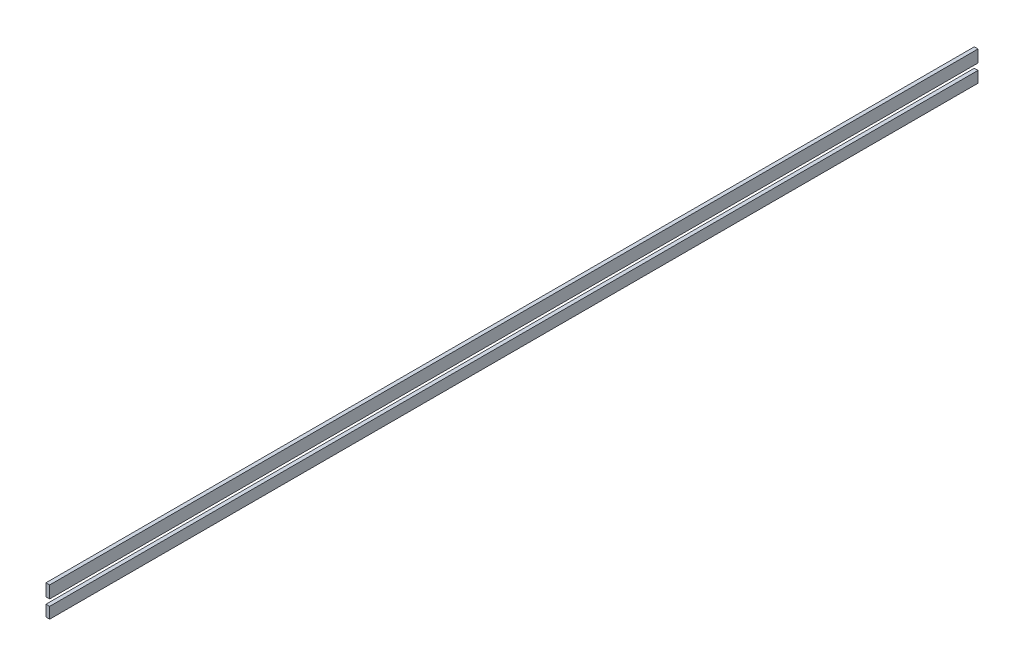
ISO-10303-21;
HEADER;
FILE_DESCRIPTION(('STEP AP214'),'2;1');
FILE_NAME('part.step','',(''),(''),'','','');
FILE_SCHEMA(('AUTOMOTIVE_DESIGN { 1 0 10303 214 1 1 1 1 }'));
ENDSEC;
DATA;
#1=APPLICATION_CONTEXT('core data for automotive mechanical design processes');
#2=APPLICATION_PROTOCOL_DEFINITION('international standard','automotive_design',2000,#1);
#3=PRODUCT_CONTEXT('',#1,'mechanical');
#4=PRODUCT('Part','Part','',(#3));
#5=PRODUCT_RELATED_PRODUCT_CATEGORY('part','',(#4));
#6=PRODUCT_DEFINITION_FORMATION('','',#4);
#7=PRODUCT_DEFINITION_CONTEXT('part definition',#1,'design');
#8=PRODUCT_DEFINITION('design','',#6,#7);
#9=PRODUCT_DEFINITION_SHAPE('','',#8);
#10=(LENGTH_UNIT() NAMED_UNIT(*) SI_UNIT(.MILLI.,.METRE.));
#11=(NAMED_UNIT(*) PLANE_ANGLE_UNIT() SI_UNIT($,.RADIAN.));
#12=(NAMED_UNIT(*) SI_UNIT($,.STERADIAN.) SOLID_ANGLE_UNIT());
#13=UNCERTAINTY_MEASURE_WITH_UNIT(LENGTH_MEASURE(1.E-05),#10,'distance_accuracy_value','');
#14=(GEOMETRIC_REPRESENTATION_CONTEXT(3) GLOBAL_UNCERTAINTY_ASSIGNED_CONTEXT((#13)) GLOBAL_UNIT_ASSIGNED_CONTEXT((#10,
#11,#12)) REPRESENTATION_CONTEXT('',''));
#15=CARTESIAN_POINT('',(0.,0.,0.));
#16=DIRECTION('',(0.,0.,1.));
#17=DIRECTION('',(1.,0.,0.));
#18=AXIS2_PLACEMENT_3D('',#15,#16,#17);
#19=CARTESIAN_POINT('',(1.,-2.,-250.));
#20=DIRECTION('',(1.,0.,0.));
#21=DIRECTION('',(0.,1.,0.));
#22=AXIS2_PLACEMENT_3D('',#19,#20,#21);
#23=PLANE('',#22);
#24=DIRECTION('',(0.,0.,1.));
#25=VECTOR('',#24,1.);
#26=CARTESIAN_POINT('',(1.,-2.,-250.));
#27=LINE('',#26,#25);
#28=CARTESIAN_POINT('',(1.,-2.,-250.));
#29=VERTEX_POINT('',#28);
#30=CARTESIAN_POINT('',(1.,-2.,250.));
#31=VERTEX_POINT('',#30);
#32=EDGE_CURVE('E68',#29,#31,#27,.T.);
#33=ORIENTED_EDGE('',*,*,#32,.T.);
#34=DIRECTION('',(0.,1.,0.));
#35=VECTOR('',#34,1.);
#36=CARTESIAN_POINT('',(1.,-2.,250.));
#37=LINE('',#36,#35);
#38=CARTESIAN_POINT('',(1.,-8.,250.));
#39=VERTEX_POINT('',#38);
#40=EDGE_CURVE('E12',#39,#31,#37,.T.);
#41=ORIENTED_EDGE('',*,*,#40,.F.);
#42=DIRECTION('',(0.,0.,1.));
#43=VECTOR('',#42,1.);
#44=CARTESIAN_POINT('',(1.,-8.,-250.));
#45=LINE('',#44,#43);
#46=CARTESIAN_POINT('',(1.,-8.,-250.));
#47=VERTEX_POINT('',#46);
#48=EDGE_CURVE('E92',#47,#39,#45,.T.);
#49=ORIENTED_EDGE('',*,*,#48,.F.);
#50=DIRECTION('',(0.,1.,0.));
#51=VECTOR('',#50,1.);
#52=CARTESIAN_POINT('',(1.,-2.,-250.));
#53=LINE('',#52,#51);
#54=EDGE_CURVE('E94',#47,#29,#53,.T.);
#55=ORIENTED_EDGE('',*,*,#54,.T.);
#56=EDGE_LOOP('',(#33,#41,#49,#55));
#57=FACE_BOUND('',#56,.T.);
#58=ADVANCED_FACE('F53',(#57),#23,.T.);
#59=CARTESIAN_POINT('',(-0.999999999999999,-8.,-250.));
#60=DIRECTION('',(0.,-1.,0.));
#61=DIRECTION('',(0.,0.,-1.));
#62=AXIS2_PLACEMENT_3D('',#59,#60,#61);
#63=PLANE('',#62);
#64=ORIENTED_EDGE('',*,*,#48,.T.);
#65=DIRECTION('',(1.,0.,0.));
#66=VECTOR('',#65,1.);
#67=CARTESIAN_POINT('',(-0.999999999999999,-8.,250.));
#68=LINE('',#67,#66);
#69=CARTESIAN_POINT('',(-0.999999999999999,-8.,250.));
#70=VERTEX_POINT('',#69);
#71=EDGE_CURVE('E108',#70,#39,#68,.T.);
#72=ORIENTED_EDGE('',*,*,#71,.F.);
#73=DIRECTION('',(0.,0.,1.));
#74=VECTOR('',#73,1.);
#75=CARTESIAN_POINT('',(-0.999999999999999,-8.,-250.));
#76=LINE('',#75,#74);
#77=CARTESIAN_POINT('',(-0.999999999999999,-8.,-250.));
#78=VERTEX_POINT('',#77);
#79=EDGE_CURVE('E99',#78,#70,#76,.T.);
#80=ORIENTED_EDGE('',*,*,#79,.F.);
#81=DIRECTION('',(1.,0.,0.));
#82=VECTOR('',#81,1.);
#83=CARTESIAN_POINT('',(-0.999999999999999,-8.,-250.));
#84=LINE('',#83,#82);
#85=EDGE_CURVE('E106',#78,#47,#84,.T.);
#86=ORIENTED_EDGE('',*,*,#85,.T.);
#87=EDGE_LOOP('',(#64,#72,#80,#86));
#88=FACE_BOUND('',#87,.T.);
#89=ADVANCED_FACE('F110',(#88),#63,.T.);
#90=CARTESIAN_POINT('',(-0.999999999999999,-2.,-250.));
#91=DIRECTION('',(-1.,0.,0.));
#92=DIRECTION('',(0.,-1.,0.));
#93=AXIS2_PLACEMENT_3D('',#90,#91,#92);
#94=PLANE('',#93);
#95=ORIENTED_EDGE('',*,*,#79,.T.);
#96=DIRECTION('',(0.,-1.,0.));
#97=VECTOR('',#96,1.);
#98=CARTESIAN_POINT('',(-0.999999999999999,-2.,250.));
#99=LINE('',#98,#97);
#100=CARTESIAN_POINT('',(-0.999999999999999,-2.,250.));
#101=VERTEX_POINT('',#100);
#102=EDGE_CURVE('E120',#101,#70,#99,.T.);
#103=ORIENTED_EDGE('',*,*,#102,.F.);
#104=DIRECTION('',(0.,0.,1.));
#105=VECTOR('',#104,1.);
#106=CARTESIAN_POINT('',(-0.999999999999999,-2.,-250.));
#107=LINE('',#106,#105);
#108=CARTESIAN_POINT('',(-0.999999999999999,-2.,-250.));
#109=VERTEX_POINT('',#108);
#110=EDGE_CURVE('E75',#109,#101,#107,.T.);
#111=ORIENTED_EDGE('',*,*,#110,.F.);
#112=DIRECTION('',(0.,-1.,0.));
#113=VECTOR('',#112,1.);
#114=CARTESIAN_POINT('',(-0.999999999999999,-2.,-250.));
#115=LINE('',#114,#113);
#116=EDGE_CURVE('E112',#109,#78,#115,.T.);
#117=ORIENTED_EDGE('',*,*,#116,.T.);
#118=EDGE_LOOP('',(#95,#103,#111,#117));
#119=FACE_BOUND('',#118,.T.);
#120=ADVANCED_FACE('F125',(#119),#94,.T.);
#121=CARTESIAN_POINT('',(-0.999999999999999,-2.,-250.));
#122=DIRECTION('',(0.,1.,0.));
#123=DIRECTION('',(0.,0.,1.));
#124=AXIS2_PLACEMENT_3D('',#121,#122,#123);
#125=PLANE('',#124);
#126=ORIENTED_EDGE('',*,*,#110,.T.);
#127=DIRECTION('',(-1.,0.,0.));
#128=VECTOR('',#127,1.);
#129=CARTESIAN_POINT('',(-0.999999999999999,-2.,250.));
#130=LINE('',#129,#128);
#131=EDGE_CURVE('E61',#31,#101,#130,.T.);
#132=ORIENTED_EDGE('',*,*,#131,.F.);
#133=ORIENTED_EDGE('',*,*,#32,.F.);
#134=DIRECTION('',(-1.,0.,0.));
#135=VECTOR('',#134,1.);
#136=CARTESIAN_POINT('',(-0.999999999999999,-2.,-250.));
#137=LINE('',#136,#135);
#138=EDGE_CURVE('E107',#29,#109,#137,.T.);
#139=ORIENTED_EDGE('',*,*,#138,.T.);
#140=EDGE_LOOP('',(#126,#132,#133,#139));
#141=FACE_BOUND('',#140,.T.);
#142=ADVANCED_FACE('F127',(#141),#125,.T.);
#143=CARTESIAN_POINT('',(0.,0.,-250.));
#144=DIRECTION('',(0.,0.,1.));
#145=DIRECTION('',(1.,0.,0.));
#146=AXIS2_PLACEMENT_3D('',#143,#144,#145);
#147=PLANE('',#146);
#148=ORIENTED_EDGE('',*,*,#54,.F.);
#149=ORIENTED_EDGE('',*,*,#85,.F.);
#150=ORIENTED_EDGE('',*,*,#116,.F.);
#151=ORIENTED_EDGE('',*,*,#138,.F.);
#152=EDGE_LOOP('',(#148,#149,#150,#151));
#153=FACE_BOUND('',#152,.T.);
#154=ADVANCED_FACE('F104',(#153),#147,.F.);
#155=CARTESIAN_POINT('',(0.,0.,250.));
#156=DIRECTION('',(0.,0.,1.));
#157=DIRECTION('',(1.,0.,0.));
#158=AXIS2_PLACEMENT_3D('',#155,#156,#157);
#159=PLANE('',#158);
#160=ORIENTED_EDGE('',*,*,#40,.T.);
#161=ORIENTED_EDGE('',*,*,#131,.T.);
#162=ORIENTED_EDGE('',*,*,#102,.T.);
#163=ORIENTED_EDGE('',*,*,#71,.T.);
#164=EDGE_LOOP('',(#160,#161,#162,#163));
#165=FACE_BOUND('',#164,.T.);
#166=ADVANCED_FACE('F55',(#165),#159,.T.);
#167=CLOSED_SHELL('',(#58,#89,#120,#142,#154,#166));
#168=MANIFOLD_SOLID_BREP('B2',#167);
#169=CARTESIAN_POINT('',(0.999999999999999,8.,-250.));
#170=DIRECTION('',(1.,0.,0.));
#171=DIRECTION('',(0.,1.,0.));
#172=AXIS2_PLACEMENT_3D('',#169,#170,#171);
#173=PLANE('',#172);
#174=DIRECTION('',(0.,0.,1.));
#175=VECTOR('',#174,1.);
#176=CARTESIAN_POINT('',(0.999999999999999,8.,-250.));
#177=LINE('',#176,#175);
#178=CARTESIAN_POINT('',(0.999999999999999,8.,-250.));
#179=VERTEX_POINT('',#178);
#180=CARTESIAN_POINT('',(0.999999999999999,8.,250.));
#181=VERTEX_POINT('',#180);
#182=EDGE_CURVE('E192',#179,#181,#177,.T.);
#183=ORIENTED_EDGE('',*,*,#182,.T.);
#184=DIRECTION('',(0.,1.,0.));
#185=VECTOR('',#184,1.);
#186=CARTESIAN_POINT('',(0.999999999999999,8.,250.));
#187=LINE('',#186,#185);
#188=CARTESIAN_POINT('',(1.,1.42857142857138,250.));
#189=VERTEX_POINT('',#188);
#190=EDGE_CURVE('E230',#189,#181,#187,.T.);
#191=ORIENTED_EDGE('',*,*,#190,.F.);
#192=DIRECTION('',(0.,0.,1.));
#193=VECTOR('',#192,1.);
#194=CARTESIAN_POINT('',(1.,1.42857142857138,-250.));
#195=LINE('',#194,#193);
#196=CARTESIAN_POINT('',(1.,1.42857142857138,-250.));
#197=VERTEX_POINT('',#196);
#198=EDGE_CURVE('E51',#197,#189,#195,.T.);
#199=ORIENTED_EDGE('',*,*,#198,.F.);
#200=DIRECTION('',(0.,1.,0.));
#201=VECTOR('',#200,1.);
#202=CARTESIAN_POINT('',(0.999999999999999,8.,-250.));
#203=LINE('',#202,#201);
#204=EDGE_CURVE('E231',#197,#179,#203,.T.);
#205=ORIENTED_EDGE('',*,*,#204,.T.);
#206=EDGE_LOOP('',(#183,#191,#199,#205));
#207=FACE_BOUND('',#206,.T.);
#208=ADVANCED_FACE('F189',(#207),#173,.T.);
#209=CARTESIAN_POINT('',(-1.,1.42857142857138,-250.));
#210=DIRECTION('',(0.,-1.,0.));
#211=DIRECTION('',(0.,0.,-1.));
#212=AXIS2_PLACEMENT_3D('',#209,#210,#211);
#213=PLANE('',#212);
#214=ORIENTED_EDGE('',*,*,#198,.T.);
#215=DIRECTION('',(1.,0.,0.));
#216=VECTOR('',#215,1.);
#217=CARTESIAN_POINT('',(-1.,1.42857142857138,250.));
#218=LINE('',#217,#216);
#219=CARTESIAN_POINT('',(-1.,1.42857142857138,250.));
#220=VERTEX_POINT('',#219);
#221=EDGE_CURVE('E249',#220,#189,#218,.T.);
#222=ORIENTED_EDGE('',*,*,#221,.F.);
#223=DIRECTION('',(0.,0.,1.));
#224=VECTOR('',#223,1.);
#225=CARTESIAN_POINT('',(-1.,1.42857142857138,-250.));
#226=LINE('',#225,#224);
#227=CARTESIAN_POINT('',(-1.,1.42857142857138,-250.));
#228=VERTEX_POINT('',#227);
#229=EDGE_CURVE('E198',#228,#220,#226,.T.);
#230=ORIENTED_EDGE('',*,*,#229,.F.);
#231=DIRECTION('',(1.,0.,0.));
#232=VECTOR('',#231,1.);
#233=CARTESIAN_POINT('',(-1.,1.42857142857138,-250.));
#234=LINE('',#233,#232);
#235=EDGE_CURVE('E237',#228,#197,#234,.T.);
#236=ORIENTED_EDGE('',*,*,#235,.T.);
#237=EDGE_LOOP('',(#214,#222,#230,#236));
#238=FACE_BOUND('',#237,.T.);
#239=ADVANCED_FACE('F273',(#238),#213,.T.);
#240=CARTESIAN_POINT('',(-1.,8.,-250.));
#241=DIRECTION('',(-1.,0.,0.));
#242=DIRECTION('',(0.,-1.,0.));
#243=AXIS2_PLACEMENT_3D('',#240,#241,#242);
#244=PLANE('',#243);
#245=ORIENTED_EDGE('',*,*,#229,.T.);
#246=DIRECTION('',(0.,-1.,0.));
#247=VECTOR('',#246,1.);
#248=CARTESIAN_POINT('',(-1.,8.,250.));
#249=LINE('',#248,#247);
#250=CARTESIAN_POINT('',(-1.,8.,250.));
#251=VERTEX_POINT('',#250);
#252=EDGE_CURVE('E245',#251,#220,#249,.T.);
#253=ORIENTED_EDGE('',*,*,#252,.F.);
#254=DIRECTION('',(0.,0.,1.));
#255=VECTOR('',#254,1.);
#256=CARTESIAN_POINT('',(-1.,8.,-250.));
#257=LINE('',#256,#255);
#258=CARTESIAN_POINT('',(-1.,8.,-250.));
#259=VERTEX_POINT('',#258);
#260=EDGE_CURVE('E236',#259,#251,#257,.T.);
#261=ORIENTED_EDGE('',*,*,#260,.F.);
#262=DIRECTION('',(0.,-1.,0.));
#263=VECTOR('',#262,1.);
#264=CARTESIAN_POINT('',(-1.,8.,-250.));
#265=LINE('',#264,#263);
#266=EDGE_CURVE('E262',#259,#228,#265,.T.);
#267=ORIENTED_EDGE('',*,*,#266,.T.);
#268=EDGE_LOOP('',(#245,#253,#261,#267));
#269=FACE_BOUND('',#268,.T.);
#270=ADVANCED_FACE('F270',(#269),#244,.T.);
#271=CARTESIAN_POINT('',(-1.,8.,-250.));
#272=DIRECTION('',(0.,1.,0.));
#273=DIRECTION('',(0.,0.,1.));
#274=AXIS2_PLACEMENT_3D('',#271,#272,#273);
#275=PLANE('',#274);
#276=ORIENTED_EDGE('',*,*,#260,.T.);
#277=DIRECTION('',(-1.,0.,0.));
#278=VECTOR('',#277,1.);
#279=CARTESIAN_POINT('',(-1.,8.,250.));
#280=LINE('',#279,#278);
#281=EDGE_CURVE('E239',#181,#251,#280,.T.);
#282=ORIENTED_EDGE('',*,*,#281,.F.);
#283=ORIENTED_EDGE('',*,*,#182,.F.);
#284=DIRECTION('',(-1.,0.,0.));
#285=VECTOR('',#284,1.);
#286=CARTESIAN_POINT('',(-1.,8.,-250.));
#287=LINE('',#286,#285);
#288=EDGE_CURVE('E259',#179,#259,#287,.T.);
#289=ORIENTED_EDGE('',*,*,#288,.T.);
#290=EDGE_LOOP('',(#276,#282,#283,#289));
#291=FACE_BOUND('',#290,.T.);
#292=ADVANCED_FACE('F240',(#291),#275,.T.);
#293=CARTESIAN_POINT('',(0.,0.,-250.));
#294=DIRECTION('',(0.,0.,1.));
#295=DIRECTION('',(1.,0.,0.));
#296=AXIS2_PLACEMENT_3D('',#293,#294,#295);
#297=PLANE('',#296);
#298=ORIENTED_EDGE('',*,*,#204,.F.);
#299=ORIENTED_EDGE('',*,*,#235,.F.);
#300=ORIENTED_EDGE('',*,*,#266,.F.);
#301=ORIENTED_EDGE('',*,*,#288,.F.);
#302=EDGE_LOOP('',(#298,#299,#300,#301));
#303=FACE_BOUND('',#302,.T.);
#304=ADVANCED_FACE('F275',(#303),#297,.F.);
#305=CARTESIAN_POINT('',(0.,0.,250.));
#306=DIRECTION('',(0.,0.,1.));
#307=DIRECTION('',(1.,0.,0.));
#308=AXIS2_PLACEMENT_3D('',#305,#306,#307);
#309=PLANE('',#308);
#310=ORIENTED_EDGE('',*,*,#190,.T.);
#311=ORIENTED_EDGE('',*,*,#281,.T.);
#312=ORIENTED_EDGE('',*,*,#252,.T.);
#313=ORIENTED_EDGE('',*,*,#221,.T.);
#314=EDGE_LOOP('',(#310,#311,#312,#313));
#315=FACE_BOUND('',#314,.T.);
#316=ADVANCED_FACE('F248',(#315),#309,.T.);
#317=CLOSED_SHELL('',(#208,#239,#270,#292,#304,#316));
#318=MANIFOLD_SOLID_BREP('B6',#317);
#319=ADVANCED_BREP_SHAPE_REPRESENTATION('',(#18,#168,#318),#14);
#320=SHAPE_DEFINITION_REPRESENTATION(#9,#319);
ENDSEC;
END-ISO-10303-21;
